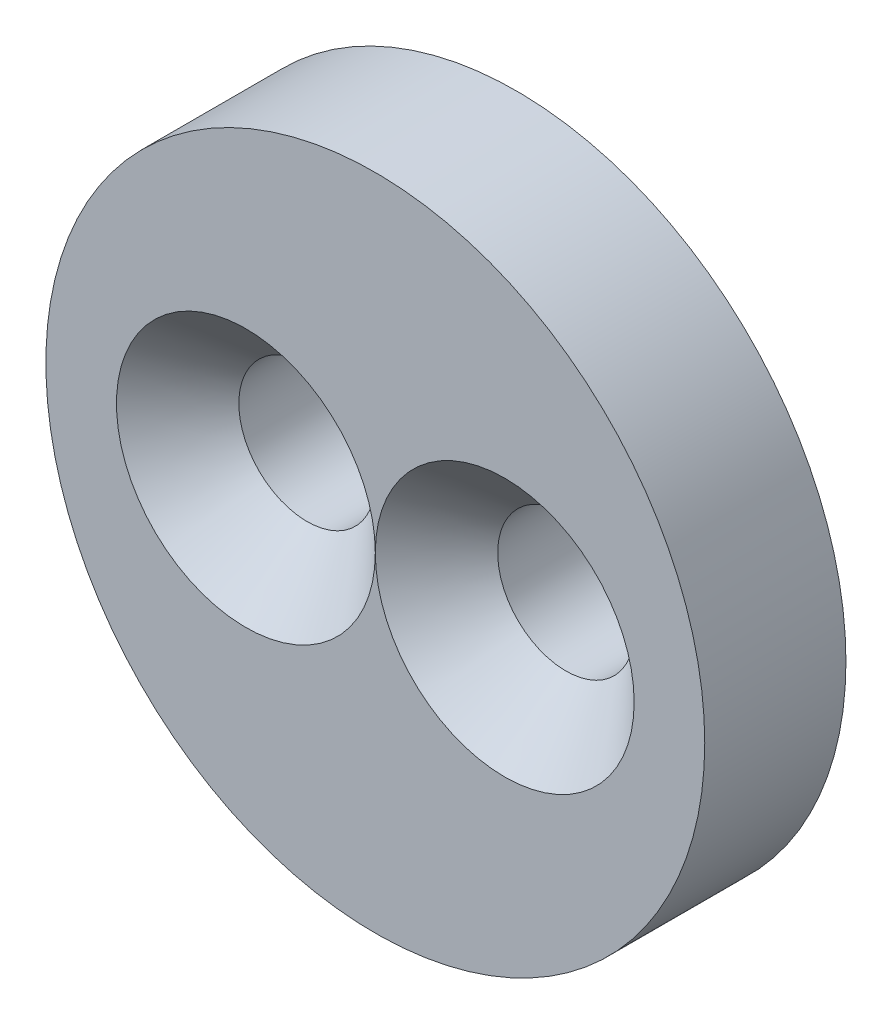
ISO-10303-21;
HEADER;
FILE_DESCRIPTION(('STEP AP214'),'2;1');
FILE_NAME('part.step','',(''),(''),'','','');
FILE_SCHEMA(('AUTOMOTIVE_DESIGN { 1 0 10303 214 1 1 1 1 }'));
ENDSEC;
DATA;
#1=APPLICATION_CONTEXT('core data for automotive mechanical design processes');
#2=APPLICATION_PROTOCOL_DEFINITION('international standard','automotive_design',2000,#1);
#3=PRODUCT_CONTEXT('',#1,'mechanical');
#4=PRODUCT('Part','Part','',(#3));
#5=PRODUCT_RELATED_PRODUCT_CATEGORY('part','',(#4));
#6=PRODUCT_DEFINITION_FORMATION('','',#4);
#7=PRODUCT_DEFINITION_CONTEXT('part definition',#1,'design');
#8=PRODUCT_DEFINITION('design','',#6,#7);
#9=PRODUCT_DEFINITION_SHAPE('','',#8);
#10=(LENGTH_UNIT() NAMED_UNIT(*) SI_UNIT(.MILLI.,.METRE.));
#11=(NAMED_UNIT(*) PLANE_ANGLE_UNIT() SI_UNIT($,.RADIAN.));
#12=(NAMED_UNIT(*) SI_UNIT($,.STERADIAN.) SOLID_ANGLE_UNIT());
#13=UNCERTAINTY_MEASURE_WITH_UNIT(LENGTH_MEASURE(1.E-05),#10,'distance_accuracy_value','');
#14=(GEOMETRIC_REPRESENTATION_CONTEXT(3) GLOBAL_UNCERTAINTY_ASSIGNED_CONTEXT((#13)) GLOBAL_UNIT_ASSIGNED_CONTEXT((#10,
#11,#12)) REPRESENTATION_CONTEXT('',''));
#15=CARTESIAN_POINT('',(0.,0.,0.));
#16=DIRECTION('',(0.,0.,1.));
#17=DIRECTION('',(1.,0.,0.));
#18=AXIS2_PLACEMENT_3D('',#15,#16,#17);
#19=CARTESIAN_POINT('',(0.,0.,29.85));
#20=DIRECTION('',(0.,0.,-1.));
#21=DIRECTION('',(-1.,0.,0.));
#22=AXIS2_PLACEMENT_3D('',#19,#20,#21);
#23=CYLINDRICAL_SURFACE('',#22,7.);
#24=CARTESIAN_POINT('',(0.,0.,29.85));
#25=DIRECTION('',(0.,0.,1.));
#26=DIRECTION('',(1.,0.,0.));
#27=AXIS2_PLACEMENT_3D('',#24,#25,#26);
#28=CIRCLE('',#27,7.);
#29=CARTESIAN_POINT('',(7.00000000000001,0.,29.85));
#30=VERTEX_POINT('',#29);
#31=EDGE_CURVE('E11',#30,#30,#28,.T.);
#32=ORIENTED_EDGE('',*,*,#31,.F.);
#33=EDGE_LOOP('',(#32));
#34=FACE_BOUND('',#33,.T.);
#35=CARTESIAN_POINT('',(0.,0.,26.85));
#36=DIRECTION('',(0.,0.,1.));
#37=DIRECTION('',(1.,0.,0.));
#38=AXIS2_PLACEMENT_3D('',#35,#36,#37);
#39=CIRCLE('',#38,7.);
#40=CARTESIAN_POINT('',(7.00000000000001,0.,26.85));
#41=VERTEX_POINT('',#40);
#42=EDGE_CURVE('E42',#41,#41,#39,.T.);
#43=ORIENTED_EDGE('',*,*,#42,.T.);
#44=EDGE_LOOP('',(#43));
#45=FACE_BOUND('',#44,.T.);
#46=ADVANCED_FACE('F39',(#34,#45),#23,.T.);
#47=CARTESIAN_POINT('',(0.,0.,29.85));
#48=DIRECTION('',(0.,0.,1.));
#49=DIRECTION('',(1.,0.,0.));
#50=AXIS2_PLACEMENT_3D('',#47,#48,#49);
#51=PLANE('',#50);
#52=CARTESIAN_POINT('',(2.74999999999782,3.33114472126336E-13,29.85));
#53=DIRECTION('',(0.,0.,1.));
#54=DIRECTION('',(1.,0.,0.));
#55=AXIS2_PLACEMENT_3D('',#52,#53,#54);
#56=CIRCLE('',#55,2.75);
#57=CARTESIAN_POINT('',(-2.18141477104083E-12,3.30375110899629E-13,29.85));
#58=VERTEX_POINT('',#57);
#59=EDGE_CURVE('E62',#58,#58,#56,.T.);
#60=ORIENTED_EDGE('',*,*,#59,.F.);
#61=CARTESIAN_POINT('',(-2.74999999999994,3.27039647746377E-13,29.85));
#62=DIRECTION('',(0.,0.,1.));
#63=DIRECTION('',(1.,0.,0.));
#64=AXIS2_PLACEMENT_3D('',#61,#62,#63);
#65=CIRCLE('',#64,2.75);
#66=EDGE_CURVE('E49',#58,#58,#65,.T.);
#67=ORIENTED_EDGE('',*,*,#66,.F.);
#68=EDGE_LOOP('',(#60,#67));
#69=FACE_BOUND('',#68,.T.);
#70=ORIENTED_EDGE('',*,*,#31,.T.);
#71=EDGE_LOOP('',(#70));
#72=FACE_BOUND('',#71,.T.);
#73=ADVANCED_FACE('F78',(#69,#72),#51,.T.);
#74=CARTESIAN_POINT('',(0.,0.,26.85));
#75=DIRECTION('',(0.,0.,1.));
#76=DIRECTION('',(1.,0.,0.));
#77=AXIS2_PLACEMENT_3D('',#74,#75,#76);
#78=PLANE('',#77);
#79=CARTESIAN_POINT('',(-2.74999999999994,3.27039647746377E-13,26.85));
#80=DIRECTION('',(0.,0.,1.));
#81=DIRECTION('',(1.,0.,0.));
#82=AXIS2_PLACEMENT_3D('',#79,#80,#81);
#83=CIRCLE('',#82,1.45);
#84=CARTESIAN_POINT('',(-1.29999999999994,3.27039647746377E-13,26.85));
#85=VERTEX_POINT('',#84);
#86=EDGE_CURVE('E57',#85,#85,#83,.T.);
#87=ORIENTED_EDGE('',*,*,#86,.T.);
#88=EDGE_LOOP('',(#87));
#89=FACE_BOUND('',#88,.T.);
#90=CARTESIAN_POINT('',(2.74999999999782,3.33114472126336E-13,26.85));
#91=DIRECTION('',(0.,0.,1.));
#92=DIRECTION('',(1.,0.,0.));
#93=AXIS2_PLACEMENT_3D('',#90,#91,#92);
#94=CIRCLE('',#93,1.45);
#95=CARTESIAN_POINT('',(4.19999999999782,3.33114472126336E-13,26.85));
#96=VERTEX_POINT('',#95);
#97=EDGE_CURVE('E67',#96,#96,#94,.T.);
#98=ORIENTED_EDGE('',*,*,#97,.T.);
#99=EDGE_LOOP('',(#98));
#100=FACE_BOUND('',#99,.T.);
#101=ORIENTED_EDGE('',*,*,#42,.F.);
#102=EDGE_LOOP('',(#101));
#103=FACE_BOUND('',#102,.T.);
#104=ADVANCED_FACE('F75',(#89,#100,#103),#78,.F.);
#105=CARTESIAN_POINT('',(2.74999999999782,3.33114472126336E-13,29.85));
#106=DIRECTION('',(0.,0.,1.));
#107=DIRECTION('',(1.,0.,0.));
#108=AXIS2_PLACEMENT_3D('',#105,#106,#107);
#109=CYLINDRICAL_SURFACE('',#108,1.45);
#110=ORIENTED_EDGE('',*,*,#97,.F.);
#111=EDGE_LOOP('',(#110));
#112=FACE_BOUND('',#111,.T.);
#113=CARTESIAN_POINT('',(2.74999999999782,3.33114472126336E-13,28.55));
#114=DIRECTION('',(0.,0.,1.));
#115=DIRECTION('',(1.,0.,0.));
#116=AXIS2_PLACEMENT_3D('',#113,#114,#115);
#117=CIRCLE('',#116,1.45);
#118=CARTESIAN_POINT('',(4.19999999999782,3.33114472126336E-13,28.55));
#119=VERTEX_POINT('',#118);
#120=EDGE_CURVE('E64',#119,#119,#117,.T.);
#121=ORIENTED_EDGE('',*,*,#120,.T.);
#122=EDGE_LOOP('',(#121));
#123=FACE_BOUND('',#122,.T.);
#124=ADVANCED_FACE('F77',(#112,#123),#109,.F.);
#125=CARTESIAN_POINT('',(2.74999999999782,3.33114472126336E-13,29.85));
#126=DIRECTION('',(0.,0.,1.));
#127=DIRECTION('',(1.,0.,0.));
#128=AXIS2_PLACEMENT_3D('',#125,#126,#127);
#129=CONICAL_SURFACE('',#128,2.75,0.785398163397448);
#130=ORIENTED_EDGE('',*,*,#120,.F.);
#131=EDGE_LOOP('',(#130));
#132=FACE_BOUND('',#131,.T.);
#133=ORIENTED_EDGE('',*,*,#59,.T.);
#134=EDGE_LOOP('',(#133));
#135=FACE_BOUND('',#134,.T.);
#136=ADVANCED_FACE('F84',(#132,#135),#129,.F.);
#137=CARTESIAN_POINT('',(-2.74999999999994,3.27039647746377E-13,29.85));
#138=DIRECTION('',(0.,0.,1.));
#139=DIRECTION('',(1.,0.,0.));
#140=AXIS2_PLACEMENT_3D('',#137,#138,#139);
#141=CYLINDRICAL_SURFACE('',#140,1.45);
#142=ORIENTED_EDGE('',*,*,#86,.F.);
#143=EDGE_LOOP('',(#142));
#144=FACE_BOUND('',#143,.T.);
#145=CARTESIAN_POINT('',(-2.74999999999994,3.27039647746377E-13,28.55));
#146=DIRECTION('',(0.,0.,1.));
#147=DIRECTION('',(1.,0.,0.));
#148=AXIS2_PLACEMENT_3D('',#145,#146,#147);
#149=CIRCLE('',#148,1.45);
#150=CARTESIAN_POINT('',(-1.29999999999994,3.27039647746377E-13,28.55));
#151=VERTEX_POINT('',#150);
#152=EDGE_CURVE('E54',#151,#151,#149,.T.);
#153=ORIENTED_EDGE('',*,*,#152,.T.);
#154=EDGE_LOOP('',(#153));
#155=FACE_BOUND('',#154,.T.);
#156=ADVANCED_FACE('F119',(#144,#155),#141,.F.);
#157=CARTESIAN_POINT('',(-2.74999999999994,3.27039647746377E-13,29.85));
#158=DIRECTION('',(0.,0.,1.));
#159=DIRECTION('',(1.,0.,0.));
#160=AXIS2_PLACEMENT_3D('',#157,#158,#159);
#161=CONICAL_SURFACE('',#160,2.75,0.785398163397447);
#162=ORIENTED_EDGE('',*,*,#152,.F.);
#163=EDGE_LOOP('',(#162));
#164=FACE_BOUND('',#163,.T.);
#165=ORIENTED_EDGE('',*,*,#66,.T.);
#166=EDGE_LOOP('',(#165));
#167=FACE_BOUND('',#166,.T.);
#168=ADVANCED_FACE('F50',(#164,#167),#161,.F.);
#169=CLOSED_SHELL('',(#46,#73,#104,#124,#136,#156,#168));
#170=MANIFOLD_SOLID_BREP('B2',#169);
#171=ADVANCED_BREP_SHAPE_REPRESENTATION('',(#18,#170),#14);
#172=SHAPE_DEFINITION_REPRESENTATION(#9,#171);
ENDSEC;
END-ISO-10303-21;
